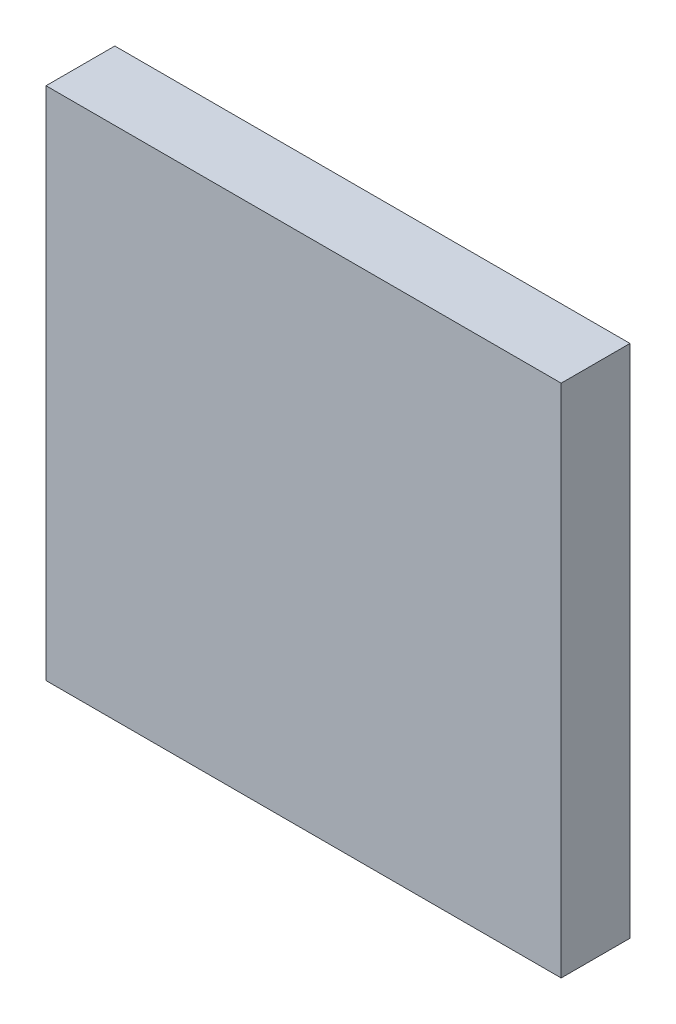
ISO-10303-21;
HEADER;
FILE_DESCRIPTION(('STEP AP214'),'2;1');
FILE_NAME('part.step','',(''),(''),'','','');
FILE_SCHEMA(('AUTOMOTIVE_DESIGN { 1 0 10303 214 1 1 1 1 }'));
ENDSEC;
DATA;
#1=APPLICATION_CONTEXT('core data for automotive mechanical design processes');
#2=APPLICATION_PROTOCOL_DEFINITION('international standard','automotive_design',2000,#1);
#3=PRODUCT_CONTEXT('',#1,'mechanical');
#4=PRODUCT('Part','Part','',(#3));
#5=PRODUCT_RELATED_PRODUCT_CATEGORY('part','',(#4));
#6=PRODUCT_DEFINITION_FORMATION('','',#4);
#7=PRODUCT_DEFINITION_CONTEXT('part definition',#1,'design');
#8=PRODUCT_DEFINITION('design','',#6,#7);
#9=PRODUCT_DEFINITION_SHAPE('','',#8);
#10=(LENGTH_UNIT() NAMED_UNIT(*) SI_UNIT(.MILLI.,.METRE.));
#11=(NAMED_UNIT(*) PLANE_ANGLE_UNIT() SI_UNIT($,.RADIAN.));
#12=(NAMED_UNIT(*) SI_UNIT($,.STERADIAN.) SOLID_ANGLE_UNIT());
#13=UNCERTAINTY_MEASURE_WITH_UNIT(LENGTH_MEASURE(1.E-05),#10,'distance_accuracy_value','');
#14=(GEOMETRIC_REPRESENTATION_CONTEXT(3) GLOBAL_UNCERTAINTY_ASSIGNED_CONTEXT((#13)) GLOBAL_UNIT_ASSIGNED_CONTEXT((#10,
#11,#12)) REPRESENTATION_CONTEXT('',''));
#15=CARTESIAN_POINT('',(0.,0.,0.));
#16=DIRECTION('',(0.,0.,1.));
#17=DIRECTION('',(1.,0.,0.));
#18=AXIS2_PLACEMENT_3D('',#15,#16,#17);
#19=CARTESIAN_POINT('',(-112.3,-112.3,30.));
#20=DIRECTION('',(1.,0.,0.));
#21=DIRECTION('',(0.,0.,-1.));
#22=AXIS2_PLACEMENT_3D('',#19,#20,#21);
#23=PLANE('',#22);
#24=DIRECTION('',(0.,-1.,0.));
#25=VECTOR('',#24,1.);
#26=CARTESIAN_POINT('',(-112.3,-112.3,0.));
#27=LINE('',#26,#25);
#28=CARTESIAN_POINT('',(-112.3,112.3,0.));
#29=VERTEX_POINT('',#28);
#30=CARTESIAN_POINT('',(-112.3,-112.3,0.));
#31=VERTEX_POINT('',#30);
#32=EDGE_CURVE('E96',#29,#31,#27,.T.);
#33=ORIENTED_EDGE('',*,*,#32,.T.);
#34=DIRECTION('',(0.,0.,-1.));
#35=VECTOR('',#34,1.);
#36=CARTESIAN_POINT('',(-112.3,-112.3,30.));
#37=LINE('',#36,#35);
#38=CARTESIAN_POINT('',(-112.3,-112.3,30.));
#39=VERTEX_POINT('',#38);
#40=EDGE_CURVE('E11',#39,#31,#37,.T.);
#41=ORIENTED_EDGE('',*,*,#40,.F.);
#42=DIRECTION('',(0.,-1.,0.));
#43=VECTOR('',#42,1.);
#44=CARTESIAN_POINT('',(-112.3,-112.3,30.));
#45=LINE('',#44,#43);
#46=CARTESIAN_POINT('',(-112.3,112.3,30.));
#47=VERTEX_POINT('',#46);
#48=EDGE_CURVE('E84',#47,#39,#45,.T.);
#49=ORIENTED_EDGE('',*,*,#48,.F.);
#50=DIRECTION('',(0.,0.,-1.));
#51=VECTOR('',#50,1.);
#52=CARTESIAN_POINT('',(-112.3,112.3,30.));
#53=LINE('',#52,#51);
#54=EDGE_CURVE('E92',#47,#29,#53,.T.);
#55=ORIENTED_EDGE('',*,*,#54,.T.);
#56=EDGE_LOOP('',(#33,#41,#49,#55));
#57=FACE_BOUND('',#56,.T.);
#58=ADVANCED_FACE('F33',(#57),#23,.F.);
#59=CARTESIAN_POINT('',(112.3,-112.3,30.));
#60=DIRECTION('',(0.,1.,0.));
#61=DIRECTION('',(-1.,0.,0.));
#62=AXIS2_PLACEMENT_3D('',#59,#60,#61);
#63=PLANE('',#62);
#64=DIRECTION('',(1.,0.,0.));
#65=VECTOR('',#64,1.);
#66=CARTESIAN_POINT('',(112.3,-112.3,0.));
#67=LINE('',#66,#65);
#68=CARTESIAN_POINT('',(112.3,-112.3,0.));
#69=VERTEX_POINT('',#68);
#70=EDGE_CURVE('E88',#31,#69,#67,.T.);
#71=ORIENTED_EDGE('',*,*,#70,.T.);
#72=DIRECTION('',(0.,0.,-1.));
#73=VECTOR('',#72,1.);
#74=CARTESIAN_POINT('',(112.3,-112.3,30.));
#75=LINE('',#74,#73);
#76=CARTESIAN_POINT('',(112.3,-112.3,30.));
#77=VERTEX_POINT('',#76);
#78=EDGE_CURVE('E41',#77,#69,#75,.T.);
#79=ORIENTED_EDGE('',*,*,#78,.F.);
#80=DIRECTION('',(1.,0.,0.));
#81=VECTOR('',#80,1.);
#82=CARTESIAN_POINT('',(112.3,-112.3,30.));
#83=LINE('',#82,#81);
#84=EDGE_CURVE('E79',#39,#77,#83,.T.);
#85=ORIENTED_EDGE('',*,*,#84,.F.);
#86=ORIENTED_EDGE('',*,*,#40,.T.);
#87=EDGE_LOOP('',(#71,#79,#85,#86));
#88=FACE_BOUND('',#87,.T.);
#89=ADVANCED_FACE('F87',(#88),#63,.F.);
#90=CARTESIAN_POINT('',(112.3,-112.3,30.));
#91=DIRECTION('',(-1.,0.,0.));
#92=DIRECTION('',(0.,0.,1.));
#93=AXIS2_PLACEMENT_3D('',#90,#91,#92);
#94=PLANE('',#93);
#95=DIRECTION('',(0.,1.,0.));
#96=VECTOR('',#95,1.);
#97=CARTESIAN_POINT('',(112.3,-112.3,0.));
#98=LINE('',#97,#96);
#99=CARTESIAN_POINT('',(112.3,112.3,0.));
#100=VERTEX_POINT('',#99);
#101=EDGE_CURVE('E66',#69,#100,#98,.T.);
#102=ORIENTED_EDGE('',*,*,#101,.T.);
#103=DIRECTION('',(0.,0.,-1.));
#104=VECTOR('',#103,1.);
#105=CARTESIAN_POINT('',(112.3,112.3,30.));
#106=LINE('',#105,#104);
#107=CARTESIAN_POINT('',(112.3,112.3,30.));
#108=VERTEX_POINT('',#107);
#109=EDGE_CURVE('E89',#108,#100,#106,.T.);
#110=ORIENTED_EDGE('',*,*,#109,.F.);
#111=DIRECTION('',(0.,1.,0.));
#112=VECTOR('',#111,1.);
#113=CARTESIAN_POINT('',(112.3,-112.3,30.));
#114=LINE('',#113,#112);
#115=EDGE_CURVE('E82',#77,#108,#114,.T.);
#116=ORIENTED_EDGE('',*,*,#115,.F.);
#117=ORIENTED_EDGE('',*,*,#78,.T.);
#118=EDGE_LOOP('',(#102,#110,#116,#117));
#119=FACE_BOUND('',#118,.T.);
#120=ADVANCED_FACE('F90',(#119),#94,.F.);
#121=CARTESIAN_POINT('',(112.3,112.3,30.));
#122=DIRECTION('',(0.,-1.,0.));
#123=DIRECTION('',(1.,0.,0.));
#124=AXIS2_PLACEMENT_3D('',#121,#122,#123);
#125=PLANE('',#124);
#126=DIRECTION('',(-1.,0.,0.));
#127=VECTOR('',#126,1.);
#128=CARTESIAN_POINT('',(112.3,112.3,0.));
#129=LINE('',#128,#127);
#130=EDGE_CURVE('E72',#100,#29,#129,.T.);
#131=ORIENTED_EDGE('',*,*,#130,.T.);
#132=ORIENTED_EDGE('',*,*,#54,.F.);
#133=DIRECTION('',(-1.,0.,0.));
#134=VECTOR('',#133,1.);
#135=CARTESIAN_POINT('',(112.3,112.3,30.));
#136=LINE('',#135,#134);
#137=EDGE_CURVE('E49',#108,#47,#136,.T.);
#138=ORIENTED_EDGE('',*,*,#137,.F.);
#139=ORIENTED_EDGE('',*,*,#109,.T.);
#140=EDGE_LOOP('',(#131,#132,#138,#139));
#141=FACE_BOUND('',#140,.T.);
#142=ADVANCED_FACE('F103',(#141),#125,.F.);
#143=CARTESIAN_POINT('',(0.,0.,30.));
#144=DIRECTION('',(0.,0.,1.));
#145=DIRECTION('',(1.,0.,0.));
#146=AXIS2_PLACEMENT_3D('',#143,#144,#145);
#147=PLANE('',#146);
#148=ORIENTED_EDGE('',*,*,#48,.T.);
#149=ORIENTED_EDGE('',*,*,#84,.T.);
#150=ORIENTED_EDGE('',*,*,#115,.T.);
#151=ORIENTED_EDGE('',*,*,#137,.T.);
#152=EDGE_LOOP('',(#148,#149,#150,#151));
#153=FACE_BOUND('',#152,.T.);
#154=ADVANCED_FACE('F80',(#153),#147,.T.);
#155=CARTESIAN_POINT('',(0.,0.,0.));
#156=DIRECTION('',(0.,0.,1.));
#157=DIRECTION('',(1.,0.,0.));
#158=AXIS2_PLACEMENT_3D('',#155,#156,#157);
#159=PLANE('',#158);
#160=ORIENTED_EDGE('',*,*,#32,.F.);
#161=ORIENTED_EDGE('',*,*,#130,.F.);
#162=ORIENTED_EDGE('',*,*,#101,.F.);
#163=ORIENTED_EDGE('',*,*,#70,.F.);
#164=EDGE_LOOP('',(#160,#161,#162,#163));
#165=FACE_BOUND('',#164,.T.);
#166=ADVANCED_FACE('F106',(#165),#159,.F.);
#167=CLOSED_SHELL('',(#58,#89,#120,#142,#154,#166));
#168=MANIFOLD_SOLID_BREP('B2',#167);
#169=ADVANCED_BREP_SHAPE_REPRESENTATION('',(#18,#168),#14);
#170=SHAPE_DEFINITION_REPRESENTATION(#9,#169);
ENDSEC;
END-ISO-10303-21;
